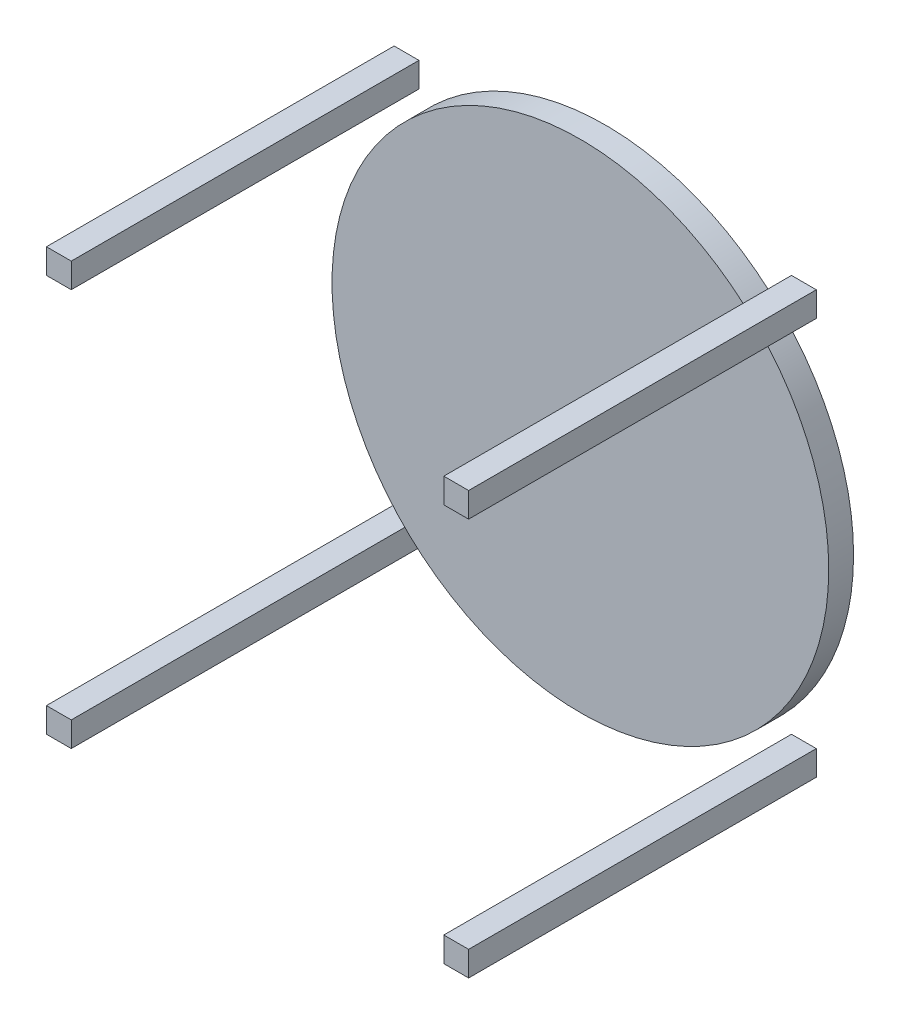
ISO-10303-21;
HEADER;
FILE_DESCRIPTION(('STEP AP214'),'2;1');
FILE_NAME('part.step','',(''),(''),'','','');
FILE_SCHEMA(('AUTOMOTIVE_DESIGN { 1 0 10303 214 1 1 1 1 }'));
ENDSEC;
DATA;
#1=APPLICATION_CONTEXT('core data for automotive mechanical design processes');
#2=APPLICATION_PROTOCOL_DEFINITION('international standard','automotive_design',2000,#1);
#3=PRODUCT_CONTEXT('',#1,'mechanical');
#4=PRODUCT('Part','Part','',(#3));
#5=PRODUCT_RELATED_PRODUCT_CATEGORY('part','',(#4));
#6=PRODUCT_DEFINITION_FORMATION('','',#4);
#7=PRODUCT_DEFINITION_CONTEXT('part definition',#1,'design');
#8=PRODUCT_DEFINITION('design','',#6,#7);
#9=PRODUCT_DEFINITION_SHAPE('','',#8);
#10=(LENGTH_UNIT() NAMED_UNIT(*) SI_UNIT(.MILLI.,.METRE.));
#11=(NAMED_UNIT(*) PLANE_ANGLE_UNIT() SI_UNIT($,.RADIAN.));
#12=(NAMED_UNIT(*) SI_UNIT($,.STERADIAN.) SOLID_ANGLE_UNIT());
#13=UNCERTAINTY_MEASURE_WITH_UNIT(LENGTH_MEASURE(1.E-05),#10,'distance_accuracy_value','');
#14=(GEOMETRIC_REPRESENTATION_CONTEXT(3) GLOBAL_UNCERTAINTY_ASSIGNED_CONTEXT((#13)) GLOBAL_UNIT_ASSIGNED_CONTEXT((#10,
#11,#12)) REPRESENTATION_CONTEXT('',''));
#15=CARTESIAN_POINT('',(0.,0.,0.));
#16=DIRECTION('',(0.,0.,1.));
#17=DIRECTION('',(1.,0.,0.));
#18=AXIS2_PLACEMENT_3D('',#15,#16,#17);
#19=CARTESIAN_POINT('',(-375.,-425.,700.));
#20=DIRECTION('',(-1.,0.,0.));
#21=DIRECTION('',(0.,0.,1.));
#22=AXIS2_PLACEMENT_3D('',#19,#20,#21);
#23=PLANE('',#22);
#24=DIRECTION('',(0.,1.,0.));
#25=VECTOR('',#24,1.);
#26=CARTESIAN_POINT('',(-375.,-425.,0.));
#27=LINE('',#26,#25);
#28=CARTESIAN_POINT('',(-375.,-425.,0.));
#29=VERTEX_POINT('',#28);
#30=CARTESIAN_POINT('',(-375.,-375.,0.));
#31=VERTEX_POINT('',#30);
#32=EDGE_CURVE('E115',#29,#31,#27,.T.);
#33=ORIENTED_EDGE('',*,*,#32,.T.);
#34=DIRECTION('',(0.,0.,-1.));
#35=VECTOR('',#34,1.);
#36=CARTESIAN_POINT('',(-375.,-375.,700.));
#37=LINE('',#36,#35);
#38=CARTESIAN_POINT('',(-375.,-375.,700.));
#39=VERTEX_POINT('',#38);
#40=EDGE_CURVE('E12',#39,#31,#37,.T.);
#41=ORIENTED_EDGE('',*,*,#40,.F.);
#42=DIRECTION('',(0.,1.,0.));
#43=VECTOR('',#42,1.);
#44=CARTESIAN_POINT('',(-375.,-425.,700.));
#45=LINE('',#44,#43);
#46=CARTESIAN_POINT('',(-375.,-425.,700.));
#47=VERTEX_POINT('',#46);
#48=EDGE_CURVE('E103',#47,#39,#45,.T.);
#49=ORIENTED_EDGE('',*,*,#48,.F.);
#50=DIRECTION('',(0.,0.,-1.));
#51=VECTOR('',#50,1.);
#52=CARTESIAN_POINT('',(-375.,-425.,700.));
#53=LINE('',#52,#51);
#54=EDGE_CURVE('E111',#47,#29,#53,.T.);
#55=ORIENTED_EDGE('',*,*,#54,.T.);
#56=EDGE_LOOP('',(#33,#41,#49,#55));
#57=FACE_BOUND('',#56,.T.);
#58=ADVANCED_FACE('F52',(#57),#23,.F.);
#59=CARTESIAN_POINT('',(-425.,-375.,700.));
#60=DIRECTION('',(0.,-1.,0.));
#61=DIRECTION('',(0.,0.,-1.));
#62=AXIS2_PLACEMENT_3D('',#59,#60,#61);
#63=PLANE('',#62);
#64=DIRECTION('',(-1.,0.,0.));
#65=VECTOR('',#64,1.);
#66=CARTESIAN_POINT('',(-425.,-375.,0.));
#67=LINE('',#66,#65);
#68=CARTESIAN_POINT('',(-425.,-375.,0.));
#69=VERTEX_POINT('',#68);
#70=EDGE_CURVE('E107',#31,#69,#67,.T.);
#71=ORIENTED_EDGE('',*,*,#70,.T.);
#72=DIRECTION('',(0.,0.,-1.));
#73=VECTOR('',#72,1.);
#74=CARTESIAN_POINT('',(-425.,-375.,700.));
#75=LINE('',#74,#73);
#76=CARTESIAN_POINT('',(-425.,-375.,700.));
#77=VERTEX_POINT('',#76);
#78=EDGE_CURVE('E60',#77,#69,#75,.T.);
#79=ORIENTED_EDGE('',*,*,#78,.F.);
#80=DIRECTION('',(-1.,0.,0.));
#81=VECTOR('',#80,1.);
#82=CARTESIAN_POINT('',(-425.,-375.,700.));
#83=LINE('',#82,#81);
#84=EDGE_CURVE('E98',#39,#77,#83,.T.);
#85=ORIENTED_EDGE('',*,*,#84,.F.);
#86=ORIENTED_EDGE('',*,*,#40,.T.);
#87=EDGE_LOOP('',(#71,#79,#85,#86));
#88=FACE_BOUND('',#87,.T.);
#89=ADVANCED_FACE('F106',(#88),#63,.F.);
#90=CARTESIAN_POINT('',(-425.,-425.,700.));
#91=DIRECTION('',(1.,0.,0.));
#92=DIRECTION('',(0.,0.,-1.));
#93=AXIS2_PLACEMENT_3D('',#90,#91,#92);
#94=PLANE('',#93);
#95=DIRECTION('',(0.,-1.,0.));
#96=VECTOR('',#95,1.);
#97=CARTESIAN_POINT('',(-425.,-425.,0.));
#98=LINE('',#97,#96);
#99=CARTESIAN_POINT('',(-425.,-425.,0.));
#100=VERTEX_POINT('',#99);
#101=EDGE_CURVE('E85',#69,#100,#98,.T.);
#102=ORIENTED_EDGE('',*,*,#101,.T.);
#103=DIRECTION('',(0.,0.,-1.));
#104=VECTOR('',#103,1.);
#105=CARTESIAN_POINT('',(-425.,-425.,700.));
#106=LINE('',#105,#104);
#107=CARTESIAN_POINT('',(-425.,-425.,700.));
#108=VERTEX_POINT('',#107);
#109=EDGE_CURVE('E108',#108,#100,#106,.T.);
#110=ORIENTED_EDGE('',*,*,#109,.F.);
#111=DIRECTION('',(0.,-1.,0.));
#112=VECTOR('',#111,1.);
#113=CARTESIAN_POINT('',(-425.,-425.,700.));
#114=LINE('',#113,#112);
#115=EDGE_CURVE('E101',#77,#108,#114,.T.);
#116=ORIENTED_EDGE('',*,*,#115,.F.);
#117=ORIENTED_EDGE('',*,*,#78,.T.);
#118=EDGE_LOOP('',(#102,#110,#116,#117));
#119=FACE_BOUND('',#118,.T.);
#120=ADVANCED_FACE('F109',(#119),#94,.F.);
#121=CARTESIAN_POINT('',(-425.,-425.,700.));
#122=DIRECTION('',(0.,1.,0.));
#123=DIRECTION('',(0.,0.,1.));
#124=AXIS2_PLACEMENT_3D('',#121,#122,#123);
#125=PLANE('',#124);
#126=DIRECTION('',(1.,0.,0.));
#127=VECTOR('',#126,1.);
#128=CARTESIAN_POINT('',(-425.,-425.,0.));
#129=LINE('',#128,#127);
#130=EDGE_CURVE('E91',#100,#29,#129,.T.);
#131=ORIENTED_EDGE('',*,*,#130,.T.);
#132=ORIENTED_EDGE('',*,*,#54,.F.);
#133=DIRECTION('',(1.,0.,0.));
#134=VECTOR('',#133,1.);
#135=CARTESIAN_POINT('',(-425.,-425.,700.));
#136=LINE('',#135,#134);
#137=EDGE_CURVE('E68',#108,#47,#136,.T.);
#138=ORIENTED_EDGE('',*,*,#137,.F.);
#139=ORIENTED_EDGE('',*,*,#109,.T.);
#140=EDGE_LOOP('',(#131,#132,#138,#139));
#141=FACE_BOUND('',#140,.T.);
#142=ADVANCED_FACE('F122',(#141),#125,.F.);
#143=CARTESIAN_POINT('',(0.,0.,700.));
#144=DIRECTION('',(0.,0.,-1.));
#145=DIRECTION('',(-1.,0.,0.));
#146=AXIS2_PLACEMENT_3D('',#143,#144,#145);
#147=PLANE('',#146);
#148=ORIENTED_EDGE('',*,*,#48,.T.);
#149=ORIENTED_EDGE('',*,*,#84,.T.);
#150=ORIENTED_EDGE('',*,*,#115,.T.);
#151=ORIENTED_EDGE('',*,*,#137,.T.);
#152=EDGE_LOOP('',(#148,#149,#150,#151));
#153=FACE_BOUND('',#152,.T.);
#154=ADVANCED_FACE('F99',(#153),#147,.F.);
#155=CARTESIAN_POINT('',(0.,0.,0.));
#156=DIRECTION('',(0.,0.,-1.));
#157=DIRECTION('',(-1.,0.,0.));
#158=AXIS2_PLACEMENT_3D('',#155,#156,#157);
#159=PLANE('',#158);
#160=ORIENTED_EDGE('',*,*,#32,.F.);
#161=ORIENTED_EDGE('',*,*,#130,.F.);
#162=ORIENTED_EDGE('',*,*,#101,.F.);
#163=ORIENTED_EDGE('',*,*,#70,.F.);
#164=EDGE_LOOP('',(#160,#161,#162,#163));
#165=FACE_BOUND('',#164,.T.);
#166=ADVANCED_FACE('F125',(#165),#159,.T.);
#167=CLOSED_SHELL('',(#58,#89,#120,#142,#154,#166));
#168=MANIFOLD_SOLID_BREP('B2',#167);
#169=CARTESIAN_POINT('',(425.,-425.,700.));
#170=DIRECTION('',(-1.,0.,0.));
#171=DIRECTION('',(0.,0.,1.));
#172=AXIS2_PLACEMENT_3D('',#169,#170,#171);
#173=PLANE('',#172);
#174=DIRECTION('',(0.,1.,0.));
#175=VECTOR('',#174,1.);
#176=CARTESIAN_POINT('',(425.,-425.,0.));
#177=LINE('',#176,#175);
#178=CARTESIAN_POINT('',(425.,-425.,0.));
#179=VERTEX_POINT('',#178);
#180=CARTESIAN_POINT('',(425.,-375.,0.));
#181=VERTEX_POINT('',#180);
#182=EDGE_CURVE('E249',#179,#181,#177,.T.);
#183=ORIENTED_EDGE('',*,*,#182,.T.);
#184=DIRECTION('',(0.,0.,-1.));
#185=VECTOR('',#184,1.);
#186=CARTESIAN_POINT('',(425.,-375.,700.));
#187=LINE('',#186,#185);
#188=CARTESIAN_POINT('',(425.,-375.,700.));
#189=VERTEX_POINT('',#188);
#190=EDGE_CURVE('E50',#189,#181,#187,.T.);
#191=ORIENTED_EDGE('',*,*,#190,.F.);
#192=DIRECTION('',(0.,1.,0.));
#193=VECTOR('',#192,1.);
#194=CARTESIAN_POINT('',(425.,-425.,700.));
#195=LINE('',#194,#193);
#196=CARTESIAN_POINT('',(425.,-425.,700.));
#197=VERTEX_POINT('',#196);
#198=EDGE_CURVE('E237',#197,#189,#195,.T.);
#199=ORIENTED_EDGE('',*,*,#198,.F.);
#200=DIRECTION('',(0.,0.,-1.));
#201=VECTOR('',#200,1.);
#202=CARTESIAN_POINT('',(425.,-425.,700.));
#203=LINE('',#202,#201);
#204=EDGE_CURVE('E245',#197,#179,#203,.T.);
#205=ORIENTED_EDGE('',*,*,#204,.T.);
#206=EDGE_LOOP('',(#183,#191,#199,#205));
#207=FACE_BOUND('',#206,.T.);
#208=ADVANCED_FACE('F186',(#207),#173,.F.);
#209=CARTESIAN_POINT('',(375.,-375.,700.));
#210=DIRECTION('',(0.,-1.,0.));
#211=DIRECTION('',(0.,0.,-1.));
#212=AXIS2_PLACEMENT_3D('',#209,#210,#211);
#213=PLANE('',#212);
#214=DIRECTION('',(-1.,0.,0.));
#215=VECTOR('',#214,1.);
#216=CARTESIAN_POINT('',(375.,-375.,0.));
#217=LINE('',#216,#215);
#218=CARTESIAN_POINT('',(375.,-375.,0.));
#219=VERTEX_POINT('',#218);
#220=EDGE_CURVE('E241',#181,#219,#217,.T.);
#221=ORIENTED_EDGE('',*,*,#220,.T.);
#222=DIRECTION('',(0.,0.,-1.));
#223=VECTOR('',#222,1.);
#224=CARTESIAN_POINT('',(375.,-375.,700.));
#225=LINE('',#224,#223);
#226=CARTESIAN_POINT('',(375.,-375.,700.));
#227=VERTEX_POINT('',#226);
#228=EDGE_CURVE('E194',#227,#219,#225,.T.);
#229=ORIENTED_EDGE('',*,*,#228,.F.);
#230=DIRECTION('',(-1.,0.,0.));
#231=VECTOR('',#230,1.);
#232=CARTESIAN_POINT('',(375.,-375.,700.));
#233=LINE('',#232,#231);
#234=EDGE_CURVE('E232',#189,#227,#233,.T.);
#235=ORIENTED_EDGE('',*,*,#234,.F.);
#236=ORIENTED_EDGE('',*,*,#190,.T.);
#237=EDGE_LOOP('',(#221,#229,#235,#236));
#238=FACE_BOUND('',#237,.T.);
#239=ADVANCED_FACE('F240',(#238),#213,.F.);
#240=CARTESIAN_POINT('',(375.,-425.,700.));
#241=DIRECTION('',(1.,0.,0.));
#242=DIRECTION('',(0.,0.,-1.));
#243=AXIS2_PLACEMENT_3D('',#240,#241,#242);
#244=PLANE('',#243);
#245=DIRECTION('',(0.,-1.,0.));
#246=VECTOR('',#245,1.);
#247=CARTESIAN_POINT('',(375.,-425.,0.));
#248=LINE('',#247,#246);
#249=CARTESIAN_POINT('',(375.,-425.,0.));
#250=VERTEX_POINT('',#249);
#251=EDGE_CURVE('E219',#219,#250,#248,.T.);
#252=ORIENTED_EDGE('',*,*,#251,.T.);
#253=DIRECTION('',(0.,0.,-1.));
#254=VECTOR('',#253,1.);
#255=CARTESIAN_POINT('',(375.,-425.,700.));
#256=LINE('',#255,#254);
#257=CARTESIAN_POINT('',(375.,-425.,700.));
#258=VERTEX_POINT('',#257);
#259=EDGE_CURVE('E242',#258,#250,#256,.T.);
#260=ORIENTED_EDGE('',*,*,#259,.F.);
#261=DIRECTION('',(0.,-1.,0.));
#262=VECTOR('',#261,1.);
#263=CARTESIAN_POINT('',(375.,-425.,700.));
#264=LINE('',#263,#262);
#265=EDGE_CURVE('E235',#227,#258,#264,.T.);
#266=ORIENTED_EDGE('',*,*,#265,.F.);
#267=ORIENTED_EDGE('',*,*,#228,.T.);
#268=EDGE_LOOP('',(#252,#260,#266,#267));
#269=FACE_BOUND('',#268,.T.);
#270=ADVANCED_FACE('F243',(#269),#244,.F.);
#271=CARTESIAN_POINT('',(375.,-425.,700.));
#272=DIRECTION('',(0.,1.,0.));
#273=DIRECTION('',(0.,0.,1.));
#274=AXIS2_PLACEMENT_3D('',#271,#272,#273);
#275=PLANE('',#274);
#276=DIRECTION('',(1.,0.,0.));
#277=VECTOR('',#276,1.);
#278=CARTESIAN_POINT('',(375.,-425.,0.));
#279=LINE('',#278,#277);
#280=EDGE_CURVE('E225',#250,#179,#279,.T.);
#281=ORIENTED_EDGE('',*,*,#280,.T.);
#282=ORIENTED_EDGE('',*,*,#204,.F.);
#283=DIRECTION('',(1.,0.,0.));
#284=VECTOR('',#283,1.);
#285=CARTESIAN_POINT('',(375.,-425.,700.));
#286=LINE('',#285,#284);
#287=EDGE_CURVE('E202',#258,#197,#286,.T.);
#288=ORIENTED_EDGE('',*,*,#287,.F.);
#289=ORIENTED_EDGE('',*,*,#259,.T.);
#290=EDGE_LOOP('',(#281,#282,#288,#289));
#291=FACE_BOUND('',#290,.T.);
#292=ADVANCED_FACE('F256',(#291),#275,.F.);
#293=CARTESIAN_POINT('',(0.,0.,700.));
#294=DIRECTION('',(0.,0.,-1.));
#295=DIRECTION('',(-1.,0.,0.));
#296=AXIS2_PLACEMENT_3D('',#293,#294,#295);
#297=PLANE('',#296);
#298=ORIENTED_EDGE('',*,*,#198,.T.);
#299=ORIENTED_EDGE('',*,*,#234,.T.);
#300=ORIENTED_EDGE('',*,*,#265,.T.);
#301=ORIENTED_EDGE('',*,*,#287,.T.);
#302=EDGE_LOOP('',(#298,#299,#300,#301));
#303=FACE_BOUND('',#302,.T.);
#304=ADVANCED_FACE('F233',(#303),#297,.F.);
#305=CARTESIAN_POINT('',(0.,0.,0.));
#306=DIRECTION('',(0.,0.,-1.));
#307=DIRECTION('',(-1.,0.,0.));
#308=AXIS2_PLACEMENT_3D('',#305,#306,#307);
#309=PLANE('',#308);
#310=ORIENTED_EDGE('',*,*,#182,.F.);
#311=ORIENTED_EDGE('',*,*,#280,.F.);
#312=ORIENTED_EDGE('',*,*,#251,.F.);
#313=ORIENTED_EDGE('',*,*,#220,.F.);
#314=EDGE_LOOP('',(#310,#311,#312,#313));
#315=FACE_BOUND('',#314,.T.);
#316=ADVANCED_FACE('F259',(#315),#309,.T.);
#317=CLOSED_SHELL('',(#208,#239,#270,#292,#304,#316));
#318=MANIFOLD_SOLID_BREP('B6',#317);
#319=CARTESIAN_POINT('',(-375.,375.,700.));
#320=DIRECTION('',(-1.,0.,0.));
#321=DIRECTION('',(0.,0.,1.));
#322=AXIS2_PLACEMENT_3D('',#319,#320,#321);
#323=PLANE('',#322);
#324=DIRECTION('',(0.,1.,0.));
#325=VECTOR('',#324,1.);
#326=CARTESIAN_POINT('',(-375.,375.,0.));
#327=LINE('',#326,#325);
#328=CARTESIAN_POINT('',(-375.,375.,0.));
#329=VERTEX_POINT('',#328);
#330=CARTESIAN_POINT('',(-375.,425.,0.));
#331=VERTEX_POINT('',#330);
#332=EDGE_CURVE('E383',#329,#331,#327,.T.);
#333=ORIENTED_EDGE('',*,*,#332,.T.);
#334=DIRECTION('',(0.,0.,-1.));
#335=VECTOR('',#334,1.);
#336=CARTESIAN_POINT('',(-375.,425.,700.));
#337=LINE('',#336,#335);
#338=CARTESIAN_POINT('',(-375.,425.,700.));
#339=VERTEX_POINT('',#338);
#340=EDGE_CURVE('E184',#339,#331,#337,.T.);
#341=ORIENTED_EDGE('',*,*,#340,.F.);
#342=DIRECTION('',(0.,1.,0.));
#343=VECTOR('',#342,1.);
#344=CARTESIAN_POINT('',(-375.,375.,700.));
#345=LINE('',#344,#343);
#346=CARTESIAN_POINT('',(-375.,375.,700.));
#347=VERTEX_POINT('',#346);
#348=EDGE_CURVE('E371',#347,#339,#345,.T.);
#349=ORIENTED_EDGE('',*,*,#348,.F.);
#350=DIRECTION('',(0.,0.,-1.));
#351=VECTOR('',#350,1.);
#352=CARTESIAN_POINT('',(-375.,375.,700.));
#353=LINE('',#352,#351);
#354=EDGE_CURVE('E379',#347,#329,#353,.T.);
#355=ORIENTED_EDGE('',*,*,#354,.T.);
#356=EDGE_LOOP('',(#333,#341,#349,#355));
#357=FACE_BOUND('',#356,.T.);
#358=ADVANCED_FACE('F320',(#357),#323,.F.);
#359=CARTESIAN_POINT('',(-425.,425.,700.));
#360=DIRECTION('',(0.,-1.,0.));
#361=DIRECTION('',(0.,0.,-1.));
#362=AXIS2_PLACEMENT_3D('',#359,#360,#361);
#363=PLANE('',#362);
#364=DIRECTION('',(-1.,0.,0.));
#365=VECTOR('',#364,1.);
#366=CARTESIAN_POINT('',(-425.,425.,0.));
#367=LINE('',#366,#365);
#368=CARTESIAN_POINT('',(-425.,425.,0.));
#369=VERTEX_POINT('',#368);
#370=EDGE_CURVE('E375',#331,#369,#367,.T.);
#371=ORIENTED_EDGE('',*,*,#370,.T.);
#372=DIRECTION('',(0.,0.,-1.));
#373=VECTOR('',#372,1.);
#374=CARTESIAN_POINT('',(-425.,425.,700.));
#375=LINE('',#374,#373);
#376=CARTESIAN_POINT('',(-425.,425.,700.));
#377=VERTEX_POINT('',#376);
#378=EDGE_CURVE('E328',#377,#369,#375,.T.);
#379=ORIENTED_EDGE('',*,*,#378,.F.);
#380=DIRECTION('',(-1.,0.,0.));
#381=VECTOR('',#380,1.);
#382=CARTESIAN_POINT('',(-425.,425.,700.));
#383=LINE('',#382,#381);
#384=EDGE_CURVE('E366',#339,#377,#383,.T.);
#385=ORIENTED_EDGE('',*,*,#384,.F.);
#386=ORIENTED_EDGE('',*,*,#340,.T.);
#387=EDGE_LOOP('',(#371,#379,#385,#386));
#388=FACE_BOUND('',#387,.T.);
#389=ADVANCED_FACE('F374',(#388),#363,.F.);
#390=CARTESIAN_POINT('',(-425.,375.,700.));
#391=DIRECTION('',(1.,0.,0.));
#392=DIRECTION('',(0.,0.,-1.));
#393=AXIS2_PLACEMENT_3D('',#390,#391,#392);
#394=PLANE('',#393);
#395=DIRECTION('',(0.,-1.,0.));
#396=VECTOR('',#395,1.);
#397=CARTESIAN_POINT('',(-425.,375.,0.));
#398=LINE('',#397,#396);
#399=CARTESIAN_POINT('',(-425.,375.,0.));
#400=VERTEX_POINT('',#399);
#401=EDGE_CURVE('E353',#369,#400,#398,.T.);
#402=ORIENTED_EDGE('',*,*,#401,.T.);
#403=DIRECTION('',(0.,0.,-1.));
#404=VECTOR('',#403,1.);
#405=CARTESIAN_POINT('',(-425.,375.,700.));
#406=LINE('',#405,#404);
#407=CARTESIAN_POINT('',(-425.,375.,700.));
#408=VERTEX_POINT('',#407);
#409=EDGE_CURVE('E376',#408,#400,#406,.T.);
#410=ORIENTED_EDGE('',*,*,#409,.F.);
#411=DIRECTION('',(0.,-1.,0.));
#412=VECTOR('',#411,1.);
#413=CARTESIAN_POINT('',(-425.,375.,700.));
#414=LINE('',#413,#412);
#415=EDGE_CURVE('E369',#377,#408,#414,.T.);
#416=ORIENTED_EDGE('',*,*,#415,.F.);
#417=ORIENTED_EDGE('',*,*,#378,.T.);
#418=EDGE_LOOP('',(#402,#410,#416,#417));
#419=FACE_BOUND('',#418,.T.);
#420=ADVANCED_FACE('F377',(#419),#394,.F.);
#421=CARTESIAN_POINT('',(-425.,375.,700.));
#422=DIRECTION('',(0.,1.,0.));
#423=DIRECTION('',(0.,0.,1.));
#424=AXIS2_PLACEMENT_3D('',#421,#422,#423);
#425=PLANE('',#424);
#426=DIRECTION('',(1.,0.,0.));
#427=VECTOR('',#426,1.);
#428=CARTESIAN_POINT('',(-425.,375.,0.));
#429=LINE('',#428,#427);
#430=EDGE_CURVE('E359',#400,#329,#429,.T.);
#431=ORIENTED_EDGE('',*,*,#430,.T.);
#432=ORIENTED_EDGE('',*,*,#354,.F.);
#433=DIRECTION('',(1.,0.,0.));
#434=VECTOR('',#433,1.);
#435=CARTESIAN_POINT('',(-425.,375.,700.));
#436=LINE('',#435,#434);
#437=EDGE_CURVE('E336',#408,#347,#436,.T.);
#438=ORIENTED_EDGE('',*,*,#437,.F.);
#439=ORIENTED_EDGE('',*,*,#409,.T.);
#440=EDGE_LOOP('',(#431,#432,#438,#439));
#441=FACE_BOUND('',#440,.T.);
#442=ADVANCED_FACE('F390',(#441),#425,.F.);
#443=CARTESIAN_POINT('',(0.,0.,700.));
#444=DIRECTION('',(0.,0.,-1.));
#445=DIRECTION('',(-1.,0.,0.));
#446=AXIS2_PLACEMENT_3D('',#443,#444,#445);
#447=PLANE('',#446);
#448=ORIENTED_EDGE('',*,*,#348,.T.);
#449=ORIENTED_EDGE('',*,*,#384,.T.);
#450=ORIENTED_EDGE('',*,*,#415,.T.);
#451=ORIENTED_EDGE('',*,*,#437,.T.);
#452=EDGE_LOOP('',(#448,#449,#450,#451));
#453=FACE_BOUND('',#452,.T.);
#454=ADVANCED_FACE('F367',(#453),#447,.F.);
#455=CARTESIAN_POINT('',(0.,0.,0.));
#456=DIRECTION('',(0.,0.,-1.));
#457=DIRECTION('',(-1.,0.,0.));
#458=AXIS2_PLACEMENT_3D('',#455,#456,#457);
#459=PLANE('',#458);
#460=ORIENTED_EDGE('',*,*,#332,.F.);
#461=ORIENTED_EDGE('',*,*,#430,.F.);
#462=ORIENTED_EDGE('',*,*,#401,.F.);
#463=ORIENTED_EDGE('',*,*,#370,.F.);
#464=EDGE_LOOP('',(#460,#461,#462,#463));
#465=FACE_BOUND('',#464,.T.);
#466=ADVANCED_FACE('F393',(#465),#459,.T.);
#467=CLOSED_SHELL('',(#358,#389,#420,#442,#454,#466));
#468=MANIFOLD_SOLID_BREP('B44',#467);
#469=CARTESIAN_POINT('',(425.,375.,700.));
#470=DIRECTION('',(-1.,0.,0.));
#471=DIRECTION('',(0.,0.,1.));
#472=AXIS2_PLACEMENT_3D('',#469,#470,#471);
#473=PLANE('',#472);
#474=DIRECTION('',(0.,1.,0.));
#475=VECTOR('',#474,1.);
#476=CARTESIAN_POINT('',(425.,375.,0.));
#477=LINE('',#476,#475);
#478=CARTESIAN_POINT('',(425.,375.,0.));
#479=VERTEX_POINT('',#478);
#480=CARTESIAN_POINT('',(425.,425.,0.));
#481=VERTEX_POINT('',#480);
#482=EDGE_CURVE('E514',#479,#481,#477,.T.);
#483=ORIENTED_EDGE('',*,*,#482,.T.);
#484=DIRECTION('',(0.,0.,-1.));
#485=VECTOR('',#484,1.);
#486=CARTESIAN_POINT('',(425.,425.,700.));
#487=LINE('',#486,#485);
#488=CARTESIAN_POINT('',(425.,425.,700.));
#489=VERTEX_POINT('',#488);
#490=EDGE_CURVE('E318',#489,#481,#487,.T.);
#491=ORIENTED_EDGE('',*,*,#490,.F.);
#492=DIRECTION('',(0.,1.,0.));
#493=VECTOR('',#492,1.);
#494=CARTESIAN_POINT('',(425.,375.,700.));
#495=LINE('',#494,#493);
#496=CARTESIAN_POINT('',(425.,375.,700.));
#497=VERTEX_POINT('',#496);
#498=EDGE_CURVE('E502',#497,#489,#495,.T.);
#499=ORIENTED_EDGE('',*,*,#498,.F.);
#500=DIRECTION('',(0.,0.,-1.));
#501=VECTOR('',#500,1.);
#502=CARTESIAN_POINT('',(425.,375.,700.));
#503=LINE('',#502,#501);
#504=EDGE_CURVE('E510',#497,#479,#503,.T.);
#505=ORIENTED_EDGE('',*,*,#504,.T.);
#506=EDGE_LOOP('',(#483,#491,#499,#505));
#507=FACE_BOUND('',#506,.T.);
#508=ADVANCED_FACE('F451',(#507),#473,.F.);
#509=CARTESIAN_POINT('',(375.,425.,700.));
#510=DIRECTION('',(0.,-1.,0.));
#511=DIRECTION('',(0.,0.,-1.));
#512=AXIS2_PLACEMENT_3D('',#509,#510,#511);
#513=PLANE('',#512);
#514=DIRECTION('',(-1.,0.,0.));
#515=VECTOR('',#514,1.);
#516=CARTESIAN_POINT('',(375.,425.,0.));
#517=LINE('',#516,#515);
#518=CARTESIAN_POINT('',(375.,425.,0.));
#519=VERTEX_POINT('',#518);
#520=EDGE_CURVE('E506',#481,#519,#517,.T.);
#521=ORIENTED_EDGE('',*,*,#520,.T.);
#522=DIRECTION('',(0.,0.,-1.));
#523=VECTOR('',#522,1.);
#524=CARTESIAN_POINT('',(375.,425.,700.));
#525=LINE('',#524,#523);
#526=CARTESIAN_POINT('',(375.,425.,700.));
#527=VERTEX_POINT('',#526);
#528=EDGE_CURVE('E459',#527,#519,#525,.T.);
#529=ORIENTED_EDGE('',*,*,#528,.F.);
#530=DIRECTION('',(-1.,0.,0.));
#531=VECTOR('',#530,1.);
#532=CARTESIAN_POINT('',(375.,425.,700.));
#533=LINE('',#532,#531);
#534=EDGE_CURVE('E497',#489,#527,#533,.T.);
#535=ORIENTED_EDGE('',*,*,#534,.F.);
#536=ORIENTED_EDGE('',*,*,#490,.T.);
#537=EDGE_LOOP('',(#521,#529,#535,#536));
#538=FACE_BOUND('',#537,.T.);
#539=ADVANCED_FACE('F505',(#538),#513,.F.);
#540=CARTESIAN_POINT('',(375.,375.,700.));
#541=DIRECTION('',(1.,0.,0.));
#542=DIRECTION('',(0.,0.,-1.));
#543=AXIS2_PLACEMENT_3D('',#540,#541,#542);
#544=PLANE('',#543);
#545=DIRECTION('',(0.,-1.,0.));
#546=VECTOR('',#545,1.);
#547=CARTESIAN_POINT('',(375.,375.,0.));
#548=LINE('',#547,#546);
#549=CARTESIAN_POINT('',(375.,375.,0.));
#550=VERTEX_POINT('',#549);
#551=EDGE_CURVE('E484',#519,#550,#548,.T.);
#552=ORIENTED_EDGE('',*,*,#551,.T.);
#553=DIRECTION('',(0.,0.,-1.));
#554=VECTOR('',#553,1.);
#555=CARTESIAN_POINT('',(375.,375.,700.));
#556=LINE('',#555,#554);
#557=CARTESIAN_POINT('',(375.,375.,700.));
#558=VERTEX_POINT('',#557);
#559=EDGE_CURVE('E507',#558,#550,#556,.T.);
#560=ORIENTED_EDGE('',*,*,#559,.F.);
#561=DIRECTION('',(0.,-1.,0.));
#562=VECTOR('',#561,1.);
#563=CARTESIAN_POINT('',(375.,375.,700.));
#564=LINE('',#563,#562);
#565=EDGE_CURVE('E500',#527,#558,#564,.T.);
#566=ORIENTED_EDGE('',*,*,#565,.F.);
#567=ORIENTED_EDGE('',*,*,#528,.T.);
#568=EDGE_LOOP('',(#552,#560,#566,#567));
#569=FACE_BOUND('',#568,.T.);
#570=ADVANCED_FACE('F508',(#569),#544,.F.);
#571=CARTESIAN_POINT('',(375.,375.,700.));
#572=DIRECTION('',(0.,1.,0.));
#573=DIRECTION('',(0.,0.,1.));
#574=AXIS2_PLACEMENT_3D('',#571,#572,#573);
#575=PLANE('',#574);
#576=DIRECTION('',(1.,0.,0.));
#577=VECTOR('',#576,1.);
#578=CARTESIAN_POINT('',(375.,375.,0.));
#579=LINE('',#578,#577);
#580=EDGE_CURVE('E490',#550,#479,#579,.T.);
#581=ORIENTED_EDGE('',*,*,#580,.T.);
#582=ORIENTED_EDGE('',*,*,#504,.F.);
#583=DIRECTION('',(1.,0.,0.));
#584=VECTOR('',#583,1.);
#585=CARTESIAN_POINT('',(375.,375.,700.));
#586=LINE('',#585,#584);
#587=EDGE_CURVE('E467',#558,#497,#586,.T.);
#588=ORIENTED_EDGE('',*,*,#587,.F.);
#589=ORIENTED_EDGE('',*,*,#559,.T.);
#590=EDGE_LOOP('',(#581,#582,#588,#589));
#591=FACE_BOUND('',#590,.T.);
#592=ADVANCED_FACE('F521',(#591),#575,.F.);
#593=CARTESIAN_POINT('',(0.,0.,700.));
#594=DIRECTION('',(0.,0.,-1.));
#595=DIRECTION('',(-1.,0.,0.));
#596=AXIS2_PLACEMENT_3D('',#593,#594,#595);
#597=PLANE('',#596);
#598=ORIENTED_EDGE('',*,*,#498,.T.);
#599=ORIENTED_EDGE('',*,*,#534,.T.);
#600=ORIENTED_EDGE('',*,*,#565,.T.);
#601=ORIENTED_EDGE('',*,*,#587,.T.);
#602=EDGE_LOOP('',(#598,#599,#600,#601));
#603=FACE_BOUND('',#602,.T.);
#604=ADVANCED_FACE('F498',(#603),#597,.F.);
#605=CARTESIAN_POINT('',(0.,0.,0.));
#606=DIRECTION('',(0.,0.,-1.));
#607=DIRECTION('',(-1.,0.,0.));
#608=AXIS2_PLACEMENT_3D('',#605,#606,#607);
#609=PLANE('',#608);
#610=ORIENTED_EDGE('',*,*,#482,.F.);
#611=ORIENTED_EDGE('',*,*,#580,.F.);
#612=ORIENTED_EDGE('',*,*,#551,.F.);
#613=ORIENTED_EDGE('',*,*,#520,.F.);
#614=EDGE_LOOP('',(#610,#611,#612,#613));
#615=FACE_BOUND('',#614,.T.);
#616=ADVANCED_FACE('F524',(#615),#609,.T.);
#617=CLOSED_SHELL('',(#508,#539,#570,#592,#604,#616));
#618=MANIFOLD_SOLID_BREP('B178',#617);
#619=CARTESIAN_POINT('',(0.,0.,50.));
#620=DIRECTION('',(0.,0.,-1.));
#621=DIRECTION('',(-1.,0.,0.));
#622=AXIS2_PLACEMENT_3D('',#619,#620,#621);
#623=CYLINDRICAL_SURFACE('',#622,500.);
#624=CARTESIAN_POINT('',(0.,0.,50.));
#625=DIRECTION('',(0.,0.,1.));
#626=DIRECTION('',(1.,0.,0.));
#627=AXIS2_PLACEMENT_3D('',#624,#625,#626);
#628=CIRCLE('',#627,500.);
#629=CARTESIAN_POINT('',(500.,0.,50.));
#630=VERTEX_POINT('',#629);
#631=EDGE_CURVE('E450',#630,#630,#628,.T.);
#632=ORIENTED_EDGE('',*,*,#631,.F.);
#633=EDGE_LOOP('',(#632));
#634=FACE_BOUND('',#633,.T.);
#635=CARTESIAN_POINT('',(0.,0.,0.));
#636=DIRECTION('',(0.,0.,1.));
#637=DIRECTION('',(1.,0.,0.));
#638=AXIS2_PLACEMENT_3D('',#635,#636,#637);
#639=CIRCLE('',#638,500.);
#640=CARTESIAN_POINT('',(500.,0.,0.));
#641=VERTEX_POINT('',#640);
#642=EDGE_CURVE('E578',#641,#641,#639,.T.);
#643=ORIENTED_EDGE('',*,*,#642,.T.);
#644=EDGE_LOOP('',(#643));
#645=FACE_BOUND('',#644,.T.);
#646=ADVANCED_FACE('F575',(#634,#645),#623,.T.);
#647=CARTESIAN_POINT('',(0.,0.,50.));
#648=DIRECTION('',(0.,0.,1.));
#649=DIRECTION('',(1.,0.,0.));
#650=AXIS2_PLACEMENT_3D('',#647,#648,#649);
#651=PLANE('',#650);
#652=ORIENTED_EDGE('',*,*,#631,.T.);
#653=EDGE_LOOP('',(#652));
#654=FACE_BOUND('',#653,.T.);
#655=ADVANCED_FACE('F605',(#654),#651,.T.);
#656=CARTESIAN_POINT('',(0.,0.,0.));
#657=DIRECTION('',(0.,0.,1.));
#658=DIRECTION('',(1.,0.,0.));
#659=AXIS2_PLACEMENT_3D('',#656,#657,#658);
#660=PLANE('',#659);
#661=CARTESIAN_POINT('',(0.,0.,0.));
#662=DIRECTION('',(0.,0.,1.));
#663=DIRECTION('',(1.,0.,0.));
#664=AXIS2_PLACEMENT_3D('',#661,#662,#663);
#665=CIRCLE('',#664,200.);
#666=CARTESIAN_POINT('',(200.,0.,0.));
#667=VERTEX_POINT('',#666);
#668=EDGE_CURVE('E587',#667,#667,#665,.T.);
#669=ORIENTED_EDGE('',*,*,#668,.T.);
#670=EDGE_LOOP('',(#669));
#671=FACE_BOUND('',#670,.T.);
#672=ORIENTED_EDGE('',*,*,#642,.F.);
#673=EDGE_LOOP('',(#672));
#674=FACE_BOUND('',#673,.T.);
#675=ADVANCED_FACE('F602',(#671,#674),#660,.F.);
#676=CARTESIAN_POINT('',(0.,0.,20.));
#677=DIRECTION('',(0.,0.,-1.));
#678=DIRECTION('',(-1.,0.,0.));
#679=AXIS2_PLACEMENT_3D('',#676,#677,#678);
#680=CYLINDRICAL_SURFACE('',#679,200.);
#681=CARTESIAN_POINT('',(0.,0.,20.));
#682=DIRECTION('',(0.,0.,1.));
#683=DIRECTION('',(1.,0.,0.));
#684=AXIS2_PLACEMENT_3D('',#681,#682,#683);
#685=CIRCLE('',#684,200.);
#686=CARTESIAN_POINT('',(200.,0.,20.));
#687=VERTEX_POINT('',#686);
#688=EDGE_CURVE('E585',#687,#687,#685,.T.);
#689=ORIENTED_EDGE('',*,*,#688,.T.);
#690=EDGE_LOOP('',(#689));
#691=FACE_BOUND('',#690,.T.);
#692=ORIENTED_EDGE('',*,*,#668,.F.);
#693=EDGE_LOOP('',(#692));
#694=FACE_BOUND('',#693,.T.);
#695=ADVANCED_FACE('F593',(#691,#694),#680,.F.);
#696=CARTESIAN_POINT('',(0.,0.,20.));
#697=DIRECTION('',(0.,0.,1.));
#698=DIRECTION('',(1.,0.,0.));
#699=AXIS2_PLACEMENT_3D('',#696,#697,#698);
#700=PLANE('',#699);
#701=ORIENTED_EDGE('',*,*,#688,.F.);
#702=EDGE_LOOP('',(#701));
#703=FACE_BOUND('',#702,.T.);
#704=ADVANCED_FACE('F596',(#703),#700,.F.);
#705=CLOSED_SHELL('',(#646,#655,#675,#695,#704));
#706=MANIFOLD_SOLID_BREP('B312',#705);
#707=ADVANCED_BREP_SHAPE_REPRESENTATION('',(#18,#168,#318,#468,#618,#706),#14);
#708=SHAPE_DEFINITION_REPRESENTATION(#9,#707);
ENDSEC;
END-ISO-10303-21;
